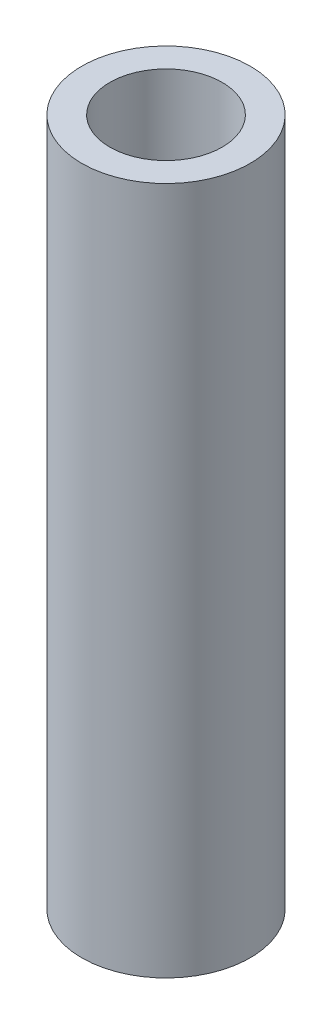
ISO-10303-21;
HEADER;
FILE_DESCRIPTION(('STEP AP214'),'2;1');
FILE_NAME('part.step','',(''),(''),'','','');
FILE_SCHEMA(('AUTOMOTIVE_DESIGN { 1 0 10303 214 1 1 1 1 }'));
ENDSEC;
DATA;
#1=APPLICATION_CONTEXT('core data for automotive mechanical design processes');
#2=APPLICATION_PROTOCOL_DEFINITION('international standard','automotive_design',2000,#1);
#3=PRODUCT_CONTEXT('',#1,'mechanical');
#4=PRODUCT('Part','Part','',(#3));
#5=PRODUCT_RELATED_PRODUCT_CATEGORY('part','',(#4));
#6=PRODUCT_DEFINITION_FORMATION('','',#4);
#7=PRODUCT_DEFINITION_CONTEXT('part definition',#1,'design');
#8=PRODUCT_DEFINITION('design','',#6,#7);
#9=PRODUCT_DEFINITION_SHAPE('','',#8);
#10=(LENGTH_UNIT() NAMED_UNIT(*) SI_UNIT(.MILLI.,.METRE.));
#11=(NAMED_UNIT(*) PLANE_ANGLE_UNIT() SI_UNIT($,.RADIAN.));
#12=(NAMED_UNIT(*) SI_UNIT($,.STERADIAN.) SOLID_ANGLE_UNIT());
#13=UNCERTAINTY_MEASURE_WITH_UNIT(LENGTH_MEASURE(1.E-05),#10,'distance_accuracy_value','');
#14=(GEOMETRIC_REPRESENTATION_CONTEXT(3) GLOBAL_UNCERTAINTY_ASSIGNED_CONTEXT((#13)) GLOBAL_UNIT_ASSIGNED_CONTEXT((#10,
#11,#12)) REPRESENTATION_CONTEXT('',''));
#15=CARTESIAN_POINT('',(0.,0.,0.));
#16=DIRECTION('',(0.,0.,1.));
#17=DIRECTION('',(1.,0.,0.));
#18=AXIS2_PLACEMENT_3D('',#15,#16,#17);
#19=CARTESIAN_POINT('',(-29.6521190716142,24.5,2.63853601908431));
#20=DIRECTION('',(0.,1.,0.));
#21=DIRECTION('',(0.,0.,1.));
#22=AXIS2_PLACEMENT_3D('',#19,#20,#21);
#23=PLANE('',#22);
#24=CARTESIAN_POINT('',(-29.6521190716142,24.5,2.63853601908431));
#25=DIRECTION('',(0.,1.,0.));
#26=DIRECTION('',(0.,0.,1.));
#27=AXIS2_PLACEMENT_3D('',#24,#25,#26);
#28=CIRCLE('',#27,3.);
#29=CARTESIAN_POINT('',(-29.6521190716142,24.5,5.63853601908432));
#30=VERTEX_POINT('',#29);
#31=EDGE_CURVE('E10',#30,#30,#28,.T.);
#32=ORIENTED_EDGE('',*,*,#31,.T.);
#33=EDGE_LOOP('',(#32));
#34=FACE_BOUND('',#33,.T.);
#35=CARTESIAN_POINT('',(-29.6521190716142,24.5,2.63853601908431));
#36=DIRECTION('',(0.,1.,0.));
#37=DIRECTION('',(0.,0.,1.));
#38=AXIS2_PLACEMENT_3D('',#35,#36,#37);
#39=CIRCLE('',#38,2.);
#40=CARTESIAN_POINT('',(-29.6521190716142,24.5,4.63853601908432));
#41=VERTEX_POINT('',#40);
#42=EDGE_CURVE('E42',#41,#41,#39,.T.);
#43=ORIENTED_EDGE('',*,*,#42,.F.);
#44=EDGE_LOOP('',(#43));
#45=FACE_BOUND('',#44,.T.);
#46=ADVANCED_FACE('F31',(#34,#45),#23,.T.);
#47=CARTESIAN_POINT('',(-29.6521190716142,0.,2.63853601908431));
#48=DIRECTION('',(0.,1.,0.));
#49=DIRECTION('',(0.,0.,1.));
#50=AXIS2_PLACEMENT_3D('',#47,#48,#49);
#51=PLANE('',#50);
#52=CARTESIAN_POINT('',(-29.6521190716142,0.,2.63853601908431));
#53=DIRECTION('',(0.,1.,0.));
#54=DIRECTION('',(0.,0.,1.));
#55=AXIS2_PLACEMENT_3D('',#52,#53,#54);
#56=CIRCLE('',#55,3.);
#57=CARTESIAN_POINT('',(-29.6521190716142,0.,5.63853601908432));
#58=VERTEX_POINT('',#57);
#59=EDGE_CURVE('E35',#58,#58,#56,.T.);
#60=ORIENTED_EDGE('',*,*,#59,.F.);
#61=EDGE_LOOP('',(#60));
#62=FACE_BOUND('',#61,.T.);
#63=CARTESIAN_POINT('',(-29.6521190716142,0.,2.63853601908431));
#64=DIRECTION('',(0.,1.,0.));
#65=DIRECTION('',(0.,0.,1.));
#66=AXIS2_PLACEMENT_3D('',#63,#64,#65);
#67=CIRCLE('',#66,2.);
#68=CARTESIAN_POINT('',(-29.6521190716142,0.,4.63853601908432));
#69=VERTEX_POINT('',#68);
#70=EDGE_CURVE('E44',#69,#69,#67,.T.);
#71=ORIENTED_EDGE('',*,*,#70,.T.);
#72=EDGE_LOOP('',(#71));
#73=FACE_BOUND('',#72,.T.);
#74=ADVANCED_FACE('F54',(#62,#73),#51,.F.);
#75=CARTESIAN_POINT('',(-29.6521190716142,24.5,2.63853601908431));
#76=DIRECTION('',(0.,-1.,0.));
#77=DIRECTION('',(0.,0.,-1.));
#78=AXIS2_PLACEMENT_3D('',#75,#76,#77);
#79=CYLINDRICAL_SURFACE('',#78,3.);
#80=ORIENTED_EDGE('',*,*,#31,.F.);
#81=EDGE_LOOP('',(#80));
#82=FACE_BOUND('',#81,.T.);
#83=ORIENTED_EDGE('',*,*,#59,.T.);
#84=EDGE_LOOP('',(#83));
#85=FACE_BOUND('',#84,.T.);
#86=ADVANCED_FACE('F33',(#82,#85),#79,.T.);
#87=CARTESIAN_POINT('',(-29.6521190716142,24.5,2.63853601908431));
#88=DIRECTION('',(0.,-1.,0.));
#89=DIRECTION('',(0.,0.,-1.));
#90=AXIS2_PLACEMENT_3D('',#87,#88,#89);
#91=CYLINDRICAL_SURFACE('',#90,2.);
#92=ORIENTED_EDGE('',*,*,#42,.T.);
#93=EDGE_LOOP('',(#92));
#94=FACE_BOUND('',#93,.T.);
#95=ORIENTED_EDGE('',*,*,#70,.F.);
#96=EDGE_LOOP('',(#95));
#97=FACE_BOUND('',#96,.T.);
#98=ADVANCED_FACE('F50',(#94,#97),#91,.F.);
#99=CLOSED_SHELL('',(#46,#74,#86,#98));
#100=MANIFOLD_SOLID_BREP('B2',#99);
#101=ADVANCED_BREP_SHAPE_REPRESENTATION('',(#18,#100),#14);
#102=SHAPE_DEFINITION_REPRESENTATION(#9,#101);
ENDSEC;
END-ISO-10303-21;
